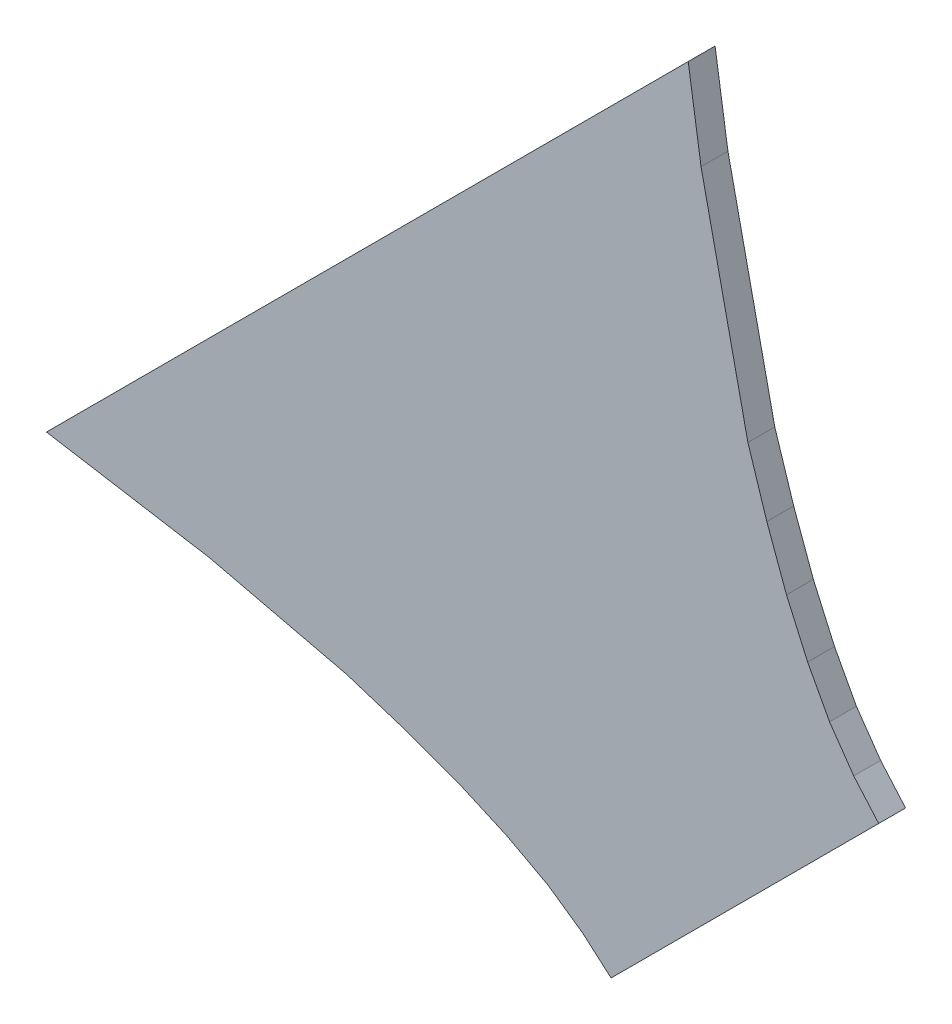
ISO-10303-21;
HEADER;
FILE_DESCRIPTION(('STEP AP214'),'2;1');
FILE_NAME('part.step','',(''),(''),'','','');
FILE_SCHEMA(('AUTOMOTIVE_DESIGN { 1 0 10303 214 1 1 1 1 }'));
ENDSEC;
DATA;
#1=APPLICATION_CONTEXT('core data for automotive mechanical design processes');
#2=APPLICATION_PROTOCOL_DEFINITION('international standard','automotive_design',2000,#1);
#3=PRODUCT_CONTEXT('',#1,'mechanical');
#4=PRODUCT('Part','Part','',(#3));
#5=PRODUCT_RELATED_PRODUCT_CATEGORY('part','',(#4));
#6=PRODUCT_DEFINITION_FORMATION('','',#4);
#7=PRODUCT_DEFINITION_CONTEXT('part definition',#1,'design');
#8=PRODUCT_DEFINITION('design','',#6,#7);
#9=PRODUCT_DEFINITION_SHAPE('','',#8);
#10=(LENGTH_UNIT() NAMED_UNIT(*) SI_UNIT(.MILLI.,.METRE.));
#11=(NAMED_UNIT(*) PLANE_ANGLE_UNIT() SI_UNIT($,.RADIAN.));
#12=(NAMED_UNIT(*) SI_UNIT($,.STERADIAN.) SOLID_ANGLE_UNIT());
#13=UNCERTAINTY_MEASURE_WITH_UNIT(LENGTH_MEASURE(1.E-05),#10,'distance_accuracy_value','');
#14=(GEOMETRIC_REPRESENTATION_CONTEXT(3) GLOBAL_UNCERTAINTY_ASSIGNED_CONTEXT((#13)) GLOBAL_UNIT_ASSIGNED_CONTEXT((#10,
#11,#12)) REPRESENTATION_CONTEXT('',''));
#15=CARTESIAN_POINT('',(0.,0.,0.));
#16=DIRECTION('',(0.,0.,1.));
#17=DIRECTION('',(1.,0.,0.));
#18=AXIS2_PLACEMENT_3D('',#15,#16,#17);
#19=CARTESIAN_POINT('',(51.6459999084473,106.226997375488,0.));
#20=DIRECTION('',(-0.755041017713103,-0.655677559148369,0.));
#21=DIRECTION('',(-0.655677559148369,0.755041017713103,0.));
#22=AXIS2_PLACEMENT_3D('',#19,#20,#21);
#23=PLANE('',#22);
#24=DIRECTION('',(-0.655677559148369,0.755041017713103,0.));
#25=VECTOR('',#24,1.);
#26=CARTESIAN_POINT('',(51.6459999084473,106.226997375488,0.03556));
#27=LINE('',#26,#25);
#28=CARTESIAN_POINT('',(51.6459999084473,106.226997375488,0.03556));
#29=VERTEX_POINT('',#28);
#30=CARTESIAN_POINT('',(51.6129989624023,106.264999389648,0.03556));
#31=VERTEX_POINT('',#30);
#32=EDGE_CURVE('E11',#29,#31,#27,.T.);
#33=ORIENTED_EDGE('',*,*,#32,.F.);
#34=DIRECTION('',(0.,0.,1.));
#35=VECTOR('',#34,1.);
#36=CARTESIAN_POINT('',(51.6459999084473,106.226997375488,0.));
#37=LINE('',#36,#35);
#38=CARTESIAN_POINT('',(51.6459999084473,106.226997375488,0.));
#39=VERTEX_POINT('',#38);
#40=EDGE_CURVE('E24',#39,#29,#37,.T.);
#41=ORIENTED_EDGE('',*,*,#40,.F.);
#42=DIRECTION('',(-0.655677559148369,0.755041017713103,0.));
#43=VECTOR('',#42,1.);
#44=CARTESIAN_POINT('',(51.6459999084473,106.226997375488,0.));
#45=LINE('',#44,#43);
#46=CARTESIAN_POINT('',(51.6129989624023,106.264999389648,0.));
#47=VERTEX_POINT('',#46);
#48=EDGE_CURVE('E160',#39,#47,#45,.T.);
#49=ORIENTED_EDGE('',*,*,#48,.T.);
#50=DIRECTION('',(0.,0.,1.));
#51=VECTOR('',#50,1.);
#52=CARTESIAN_POINT('',(51.6129989624023,106.264999389648,0.));
#53=LINE('',#52,#51);
#54=EDGE_CURVE('E37',#47,#31,#53,.T.);
#55=ORIENTED_EDGE('',*,*,#54,.T.);
#56=EDGE_LOOP('',(#33,#41,#49,#55));
#57=FACE_BOUND('',#56,.T.);
#58=ADVANCED_FACE('F17',(#57),#23,.F.);
#59=CARTESIAN_POINT('',(51.6129989624023,106.264999389648,0.));
#60=DIRECTION('',(-0.820910752232331,-0.571056509348548,0.));
#61=DIRECTION('',(-0.571056509348548,0.820910752232331,0.));
#62=AXIS2_PLACEMENT_3D('',#59,#60,#61);
#63=PLANE('',#62);
#64=DIRECTION('',(-0.571056509348548,0.820910752232331,0.));
#65=VECTOR('',#64,1.);
#66=CARTESIAN_POINT('',(51.6129989624023,106.264999389648,0.03556));
#67=LINE('',#66,#65);
#68=CARTESIAN_POINT('',(51.5810012817383,106.310997009277,0.03556));
#69=VERTEX_POINT('',#68);
#70=EDGE_CURVE('E280',#31,#69,#67,.T.);
#71=ORIENTED_EDGE('',*,*,#70,.F.);
#72=ORIENTED_EDGE('',*,*,#54,.F.);
#73=DIRECTION('',(-0.571056509348548,0.820910752232331,0.));
#74=VECTOR('',#73,1.);
#75=CARTESIAN_POINT('',(51.6129989624023,106.264999389648,0.));
#76=LINE('',#75,#74);
#77=CARTESIAN_POINT('',(51.5810012817383,106.310997009277,0.));
#78=VERTEX_POINT('',#77);
#79=EDGE_CURVE('E277',#47,#78,#76,.T.);
#80=ORIENTED_EDGE('',*,*,#79,.T.);
#81=DIRECTION('',(0.,0.,1.));
#82=VECTOR('',#81,1.);
#83=CARTESIAN_POINT('',(51.5810012817383,106.310997009277,0.));
#84=LINE('',#83,#82);
#85=EDGE_CURVE('E275',#78,#69,#84,.T.);
#86=ORIENTED_EDGE('',*,*,#85,.T.);
#87=EDGE_LOOP('',(#71,#72,#80,#86));
#88=FACE_BOUND('',#87,.T.);
#89=ADVANCED_FACE('F288',(#88),#63,.F.);
#90=CARTESIAN_POINT('',(51.5810012817383,106.310997009277,0.));
#91=DIRECTION('',(-0.88097617439256,-0.473160628278231,0.));
#92=DIRECTION('',(-0.473160628278231,0.88097617439256,0.));
#93=AXIS2_PLACEMENT_3D('',#90,#91,#92);
#94=PLANE('',#93);
#95=DIRECTION('',(-0.473160628278231,0.88097617439256,0.));
#96=VECTOR('',#95,1.);
#97=CARTESIAN_POINT('',(51.5810012817383,106.310997009277,0.03556));
#98=LINE('',#97,#96);
#99=CARTESIAN_POINT('',(51.5519981384277,106.36499786377,0.03556));
#100=VERTEX_POINT('',#99);
#101=EDGE_CURVE('E272',#69,#100,#98,.T.);
#102=ORIENTED_EDGE('',*,*,#101,.F.);
#103=ORIENTED_EDGE('',*,*,#85,.F.);
#104=DIRECTION('',(-0.473160628278231,0.88097617439256,0.));
#105=VECTOR('',#104,1.);
#106=CARTESIAN_POINT('',(51.5810012817383,106.310997009277,0.));
#107=LINE('',#106,#105);
#108=CARTESIAN_POINT('',(51.5519981384277,106.36499786377,0.));
#109=VERTEX_POINT('',#108);
#110=EDGE_CURVE('E269',#78,#109,#107,.T.);
#111=ORIENTED_EDGE('',*,*,#110,.T.);
#112=DIRECTION('',(0.,0.,1.));
#113=VECTOR('',#112,1.);
#114=CARTESIAN_POINT('',(51.5519981384277,106.36499786377,0.));
#115=LINE('',#114,#113);
#116=EDGE_CURVE('E267',#109,#100,#115,.T.);
#117=ORIENTED_EDGE('',*,*,#116,.T.);
#118=EDGE_LOOP('',(#102,#103,#111,#117));
#119=FACE_BOUND('',#118,.T.);
#120=ADVANCED_FACE('F294',(#119),#94,.F.);
#121=CARTESIAN_POINT('',(51.5519981384277,106.36499786377,0.));
#122=DIRECTION('',(-0.913820674891546,-0.406117931321382,0.));
#123=DIRECTION('',(-0.406117931321382,0.913820674891546,0.));
#124=AXIS2_PLACEMENT_3D('',#121,#122,#123);
#125=PLANE('',#124);
#126=DIRECTION('',(-0.406117931321382,0.913820674891546,0.));
#127=VECTOR('',#126,1.);
#128=CARTESIAN_POINT('',(51.5519981384277,106.36499786377,0.03556));
#129=LINE('',#128,#127);
#130=CARTESIAN_POINT('',(51.523998260498,106.428001403809,0.03556));
#131=VERTEX_POINT('',#130);
#132=EDGE_CURVE('E264',#100,#131,#129,.T.);
#133=ORIENTED_EDGE('',*,*,#132,.F.);
#134=ORIENTED_EDGE('',*,*,#116,.F.);
#135=DIRECTION('',(-0.406117931321382,0.913820674891546,0.));
#136=VECTOR('',#135,1.);
#137=CARTESIAN_POINT('',(51.5519981384277,106.36499786377,0.));
#138=LINE('',#137,#136);
#139=CARTESIAN_POINT('',(51.523998260498,106.428001403809,0.));
#140=VERTEX_POINT('',#139);
#141=EDGE_CURVE('E261',#109,#140,#138,.T.);
#142=ORIENTED_EDGE('',*,*,#141,.T.);
#143=DIRECTION('',(0.,0.,1.));
#144=VECTOR('',#143,1.);
#145=CARTESIAN_POINT('',(51.523998260498,106.428001403809,0.));
#146=LINE('',#145,#144);
#147=EDGE_CURVE('E259',#140,#131,#146,.T.);
#148=ORIENTED_EDGE('',*,*,#147,.T.);
#149=EDGE_LOOP('',(#133,#134,#142,#148));
#150=FACE_BOUND('',#149,.T.);
#151=ADVANCED_FACE('F296',(#150),#125,.F.);
#152=CARTESIAN_POINT('',(51.523998260498,106.428001403809,0.));
#153=DIRECTION('',(-0.939029508727631,-0.343836562539158,0.));
#154=DIRECTION('',(-0.343836562539158,0.939029508727631,0.));
#155=AXIS2_PLACEMENT_3D('',#152,#153,#154);
#156=PLANE('',#155);
#157=DIRECTION('',(-0.343836562539158,0.939029508727631,0.));
#158=VECTOR('',#157,1.);
#159=CARTESIAN_POINT('',(51.523998260498,106.428001403809,0.03556));
#160=LINE('',#159,#158);
#161=CARTESIAN_POINT('',(51.4980010986328,106.499000549316,0.03556));
#162=VERTEX_POINT('',#161);
#163=EDGE_CURVE('E256',#131,#162,#160,.T.);
#164=ORIENTED_EDGE('',*,*,#163,.F.);
#165=ORIENTED_EDGE('',*,*,#147,.F.);
#166=DIRECTION('',(-0.343836562539158,0.939029508727631,0.));
#167=VECTOR('',#166,1.);
#168=CARTESIAN_POINT('',(51.523998260498,106.428001403809,0.));
#169=LINE('',#168,#167);
#170=CARTESIAN_POINT('',(51.4980010986328,106.499000549316,0.));
#171=VERTEX_POINT('',#170);
#172=EDGE_CURVE('E253',#140,#171,#169,.T.);
#173=ORIENTED_EDGE('',*,*,#172,.T.);
#174=DIRECTION('',(0.,0.,1.));
#175=VECTOR('',#174,1.);
#176=CARTESIAN_POINT('',(51.4980010986328,106.499000549316,0.));
#177=LINE('',#176,#175);
#178=EDGE_CURVE('E251',#171,#162,#177,.T.);
#179=ORIENTED_EDGE('',*,*,#178,.T.);
#180=EDGE_LOOP('',(#164,#165,#173,#179));
#181=FACE_BOUND('',#180,.T.);
#182=ADVANCED_FACE('F301',(#181),#156,.F.);
#183=CARTESIAN_POINT('',(51.4980010986328,106.499000549316,0.));
#184=DIRECTION('',(-0.952280205556479,-0.305225179343562,0.));
#185=DIRECTION('',(-0.305225179343562,0.952280205556479,0.));
#186=AXIS2_PLACEMENT_3D('',#183,#184,#185);
#187=PLANE('',#186);
#188=DIRECTION('',(-0.305225179343562,0.952280205556479,0.));
#189=VECTOR('',#188,1.);
#190=CARTESIAN_POINT('',(51.4980010986328,106.499000549316,0.03556));
#191=LINE('',#190,#189);
#192=CARTESIAN_POINT('',(51.4729995727539,106.577003479004,0.03556));
#193=VERTEX_POINT('',#192);
#194=EDGE_CURVE('E248',#162,#193,#191,.T.);
#195=ORIENTED_EDGE('',*,*,#194,.F.);
#196=ORIENTED_EDGE('',*,*,#178,.F.);
#197=DIRECTION('',(-0.305225179343562,0.952280205556479,0.));
#198=VECTOR('',#197,1.);
#199=CARTESIAN_POINT('',(51.4980010986328,106.499000549316,0.));
#200=LINE('',#199,#198);
#201=CARTESIAN_POINT('',(51.4729995727539,106.577003479004,0.));
#202=VERTEX_POINT('',#201);
#203=EDGE_CURVE('E245',#171,#202,#200,.T.);
#204=ORIENTED_EDGE('',*,*,#203,.T.);
#205=DIRECTION('',(0.,0.,1.));
#206=VECTOR('',#205,1.);
#207=CARTESIAN_POINT('',(51.4729995727539,106.577003479004,0.));
#208=LINE('',#207,#206);
#209=EDGE_CURVE('E243',#202,#193,#208,.T.);
#210=ORIENTED_EDGE('',*,*,#209,.T.);
#211=EDGE_LOOP('',(#195,#196,#204,#210));
#212=FACE_BOUND('',#211,.T.);
#213=ADVANCED_FACE('F304',(#212),#187,.F.);
#214=CARTESIAN_POINT('',(51.4729995727539,106.577003479004,0.));
#215=DIRECTION('',(-0.977144599431555,-0.212575708399961,0.));
#216=DIRECTION('',(-0.212575708399961,0.977144599431555,0.));
#217=AXIS2_PLACEMENT_3D('',#214,#215,#216);
#218=PLANE('',#217);
#219=DIRECTION('',(-0.212575708399961,0.977144599431555,0.));
#220=VECTOR('',#219,1.);
#221=CARTESIAN_POINT('',(51.4729995727539,106.577003479004,0.03556));
#222=LINE('',#221,#220);
#223=CARTESIAN_POINT('',(51.4109992980957,106.861999511719,0.03556));
#224=VERTEX_POINT('',#223);
#225=EDGE_CURVE('E240',#193,#224,#222,.T.);
#226=ORIENTED_EDGE('',*,*,#225,.F.);
#227=ORIENTED_EDGE('',*,*,#209,.F.);
#228=DIRECTION('',(-0.212575708399961,0.977144599431555,0.));
#229=VECTOR('',#228,1.);
#230=CARTESIAN_POINT('',(51.4729995727539,106.577003479004,0.));
#231=LINE('',#230,#229);
#232=CARTESIAN_POINT('',(51.4109992980957,106.861999511719,0.));
#233=VERTEX_POINT('',#232);
#234=EDGE_CURVE('E237',#202,#233,#231,.T.);
#235=ORIENTED_EDGE('',*,*,#234,.T.);
#236=DIRECTION('',(0.,0.,1.));
#237=VECTOR('',#236,1.);
#238=CARTESIAN_POINT('',(51.4109992980957,106.861999511719,0.));
#239=LINE('',#238,#237);
#240=EDGE_CURVE('E235',#233,#224,#239,.T.);
#241=ORIENTED_EDGE('',*,*,#240,.T.);
#242=EDGE_LOOP('',(#226,#227,#235,#241));
#243=FACE_BOUND('',#242,.T.);
#244=ADVANCED_FACE('F309',(#243),#218,.F.);
#245=CARTESIAN_POINT('',(51.4109992980957,106.861999511719,0.));
#246=DIRECTION('',(-0.988677990191624,-0.150052763089028,0.));
#247=DIRECTION('',(-0.150052763089028,0.988677990191624,0.));
#248=AXIS2_PLACEMENT_3D('',#245,#246,#247);
#249=PLANE('',#248);
#250=DIRECTION('',(-0.150052763089028,0.988677990191624,0.));
#251=VECTOR('',#250,1.);
#252=CARTESIAN_POINT('',(51.4109992980957,106.861999511719,0.03556));
#253=LINE('',#252,#251);
#254=CARTESIAN_POINT('',(51.3940010070801,106.973999023438,0.03556));
#255=VERTEX_POINT('',#254);
#256=EDGE_CURVE('E232',#224,#255,#253,.T.);
#257=ORIENTED_EDGE('',*,*,#256,.F.);
#258=ORIENTED_EDGE('',*,*,#240,.F.);
#259=DIRECTION('',(-0.150052763089028,0.988677990191624,0.));
#260=VECTOR('',#259,1.);
#261=CARTESIAN_POINT('',(51.4109992980957,106.861999511719,0.));
#262=LINE('',#261,#260);
#263=CARTESIAN_POINT('',(51.3940010070801,106.973999023438,0.));
#264=VERTEX_POINT('',#263);
#265=EDGE_CURVE('E229',#233,#264,#262,.T.);
#266=ORIENTED_EDGE('',*,*,#265,.T.);
#267=DIRECTION('',(0.,0.,1.));
#268=VECTOR('',#267,1.);
#269=CARTESIAN_POINT('',(51.3940010070801,106.973999023438,0.));
#270=LINE('',#269,#268);
#271=EDGE_CURVE('E227',#264,#255,#270,.T.);
#272=ORIENTED_EDGE('',*,*,#271,.T.);
#273=EDGE_LOOP('',(#257,#258,#266,#272));
#274=FACE_BOUND('',#273,.T.);
#275=ADVANCED_FACE('F312',(#274),#249,.F.);
#276=CARTESIAN_POINT('',(51.3940010070801,106.973999023438,0.));
#277=DIRECTION('',(0.707105192612709,-0.707108369756817,0.));
#278=DIRECTION('',(-0.707108369756817,-0.707105192612709,0.));
#279=AXIS2_PLACEMENT_3D('',#276,#277,#278);
#280=PLANE('',#279);
#281=DIRECTION('',(-0.707108369756817,-0.707105192612709,0.));
#282=VECTOR('',#281,1.);
#283=CARTESIAN_POINT('',(51.3940010070801,106.973999023438,0.03556));
#284=LINE('',#283,#282);
#285=CARTESIAN_POINT('',(50.5449981689453,106.125,0.03556));
#286=VERTEX_POINT('',#285);
#287=EDGE_CURVE('E224',#255,#286,#284,.T.);
#288=ORIENTED_EDGE('',*,*,#287,.F.);
#289=ORIENTED_EDGE('',*,*,#271,.F.);
#290=DIRECTION('',(-0.707108369756817,-0.707105192612709,0.));
#291=VECTOR('',#290,1.);
#292=CARTESIAN_POINT('',(51.3940010070801,106.973999023438,0.));
#293=LINE('',#292,#291);
#294=CARTESIAN_POINT('',(50.5449981689453,106.125,0.));
#295=VERTEX_POINT('',#294);
#296=EDGE_CURVE('E221',#264,#295,#293,.T.);
#297=ORIENTED_EDGE('',*,*,#296,.T.);
#298=DIRECTION('',(0.,0.,1.));
#299=VECTOR('',#298,1.);
#300=CARTESIAN_POINT('',(50.5449981689453,106.125,0.));
#301=LINE('',#300,#299);
#302=EDGE_CURVE('E219',#295,#286,#301,.T.);
#303=ORIENTED_EDGE('',*,*,#302,.T.);
#304=EDGE_LOOP('',(#288,#289,#297,#303));
#305=FACE_BOUND('',#304,.T.);
#306=ADVANCED_FACE('F317',(#305),#280,.F.);
#307=CARTESIAN_POINT('',(50.5449981689453,106.125,0.));
#308=DIRECTION('',(0.165156602988561,0.986267355481909,0.));
#309=DIRECTION('',(0.986267355481909,-0.165156602988561,0.));
#310=AXIS2_PLACEMENT_3D('',#307,#308,#309);
#311=PLANE('',#310);
#312=DIRECTION('',(0.986267355481909,-0.16515660298856,0.));
#313=VECTOR('',#312,1.);
#314=CARTESIAN_POINT('',(50.5449981689453,106.125,0.03556));
#315=LINE('',#314,#313);
#316=CARTESIAN_POINT('',(50.7599983215332,106.088996887207,0.03556));
#317=VERTEX_POINT('',#316);
#318=EDGE_CURVE('E216',#286,#317,#315,.T.);
#319=ORIENTED_EDGE('',*,*,#318,.F.);
#320=ORIENTED_EDGE('',*,*,#302,.F.);
#321=DIRECTION('',(0.986267355481909,-0.16515660298856,0.));
#322=VECTOR('',#321,1.);
#323=CARTESIAN_POINT('',(50.5449981689453,106.125,0.));
#324=LINE('',#323,#322);
#325=CARTESIAN_POINT('',(50.7599983215332,106.088996887207,0.));
#326=VERTEX_POINT('',#325);
#327=EDGE_CURVE('E213',#295,#326,#324,.T.);
#328=ORIENTED_EDGE('',*,*,#327,.T.);
#329=DIRECTION('',(0.,0.,1.));
#330=VECTOR('',#329,1.);
#331=CARTESIAN_POINT('',(50.7599983215332,106.088996887207,0.));
#332=LINE('',#331,#330);
#333=EDGE_CURVE('E211',#326,#317,#332,.T.);
#334=ORIENTED_EDGE('',*,*,#333,.T.);
#335=EDGE_LOOP('',(#319,#320,#328,#334));
#336=FACE_BOUND('',#335,.T.);
#337=ADVANCED_FACE('F320',(#336),#311,.F.);
#338=CARTESIAN_POINT('',(50.7599983215332,106.088996887207,0.));
#339=DIRECTION('',(0.229926049289909,0.973208103058094,0.));
#340=DIRECTION('',(0.973208103058094,-0.229926049289909,0.));
#341=AXIS2_PLACEMENT_3D('',#338,#339,#340);
#342=PLANE('',#341);
#343=DIRECTION('',(0.973208103058094,-0.229926049289909,0.));
#344=VECTOR('',#343,1.);
#345=CARTESIAN_POINT('',(50.7599983215332,106.088996887207,0.03556));
#346=LINE('',#345,#344);
#347=CARTESIAN_POINT('',(50.9420013427734,106.045997619629,0.03556));
#348=VERTEX_POINT('',#347);
#349=EDGE_CURVE('E208',#317,#348,#346,.T.);
#350=ORIENTED_EDGE('',*,*,#349,.F.);
#351=ORIENTED_EDGE('',*,*,#333,.F.);
#352=DIRECTION('',(0.973208103058094,-0.229926049289909,0.));
#353=VECTOR('',#352,1.);
#354=CARTESIAN_POINT('',(50.7599983215332,106.088996887207,0.));
#355=LINE('',#354,#353);
#356=CARTESIAN_POINT('',(50.9420013427734,106.045997619629,0.));
#357=VERTEX_POINT('',#356);
#358=EDGE_CURVE('E205',#326,#357,#355,.T.);
#359=ORIENTED_EDGE('',*,*,#358,.T.);
#360=DIRECTION('',(0.,0.,1.));
#361=VECTOR('',#360,1.);
#362=CARTESIAN_POINT('',(50.9420013427734,106.045997619629,0.));
#363=LINE('',#362,#361);
#364=EDGE_CURVE('E203',#357,#348,#363,.T.);
#365=ORIENTED_EDGE('',*,*,#364,.T.);
#366=EDGE_LOOP('',(#350,#351,#359,#365));
#367=FACE_BOUND('',#366,.T.);
#368=ADVANCED_FACE('F325',(#367),#342,.F.);
#369=CARTESIAN_POINT('',(50.9420013427734,106.045997619629,0.));
#370=DIRECTION('',(0.305154245258206,0.952302938460706,0.));
#371=DIRECTION('',(0.952302938460706,-0.305154245258206,0.));
#372=AXIS2_PLACEMENT_3D('',#369,#370,#371);
#373=PLANE('',#372);
#374=DIRECTION('',(0.952302938460706,-0.305154245258206,0.));
#375=VECTOR('',#374,1.);
#376=CARTESIAN_POINT('',(50.9420013427734,106.045997619629,0.03556));
#377=LINE('',#376,#375);
#378=CARTESIAN_POINT('',(51.0200004577637,106.021003723145,0.03556));
#379=VERTEX_POINT('',#378);
#380=EDGE_CURVE('E200',#348,#379,#377,.T.);
#381=ORIENTED_EDGE('',*,*,#380,.F.);
#382=ORIENTED_EDGE('',*,*,#364,.F.);
#383=DIRECTION('',(0.952302938460706,-0.305154245258206,0.));
#384=VECTOR('',#383,1.);
#385=CARTESIAN_POINT('',(50.9420013427734,106.045997619629,0.));
#386=LINE('',#385,#384);
#387=CARTESIAN_POINT('',(51.0200004577637,106.021003723145,0.));
#388=VERTEX_POINT('',#387);
#389=EDGE_CURVE('E197',#357,#388,#386,.T.);
#390=ORIENTED_EDGE('',*,*,#389,.T.);
#391=DIRECTION('',(0.,0.,1.));
#392=VECTOR('',#391,1.);
#393=CARTESIAN_POINT('',(51.0200004577637,106.021003723145,0.));
#394=LINE('',#393,#392);
#395=EDGE_CURVE('E195',#388,#379,#394,.T.);
#396=ORIENTED_EDGE('',*,*,#395,.T.);
#397=EDGE_LOOP('',(#381,#382,#390,#396));
#398=FACE_BOUND('',#397,.T.);
#399=ADVANCED_FACE('F328',(#398),#373,.F.);
#400=CARTESIAN_POINT('',(51.0200004577637,106.021003723145,0.));
#401=DIRECTION('',(0.343881049565291,0.939013218091138,0.));
#402=DIRECTION('',(0.939013218091138,-0.343881049565291,0.));
#403=AXIS2_PLACEMENT_3D('',#400,#401,#402);
#404=PLANE('',#403);
#405=DIRECTION('',(0.939013218091137,-0.343881049565291,0.));
#406=VECTOR('',#405,1.);
#407=CARTESIAN_POINT('',(51.0200004577637,106.021003723145,0.03556));
#408=LINE('',#407,#406);
#409=CARTESIAN_POINT('',(51.0909996032715,105.995002746582,0.03556));
#410=VERTEX_POINT('',#409);
#411=EDGE_CURVE('E192',#379,#410,#408,.T.);
#412=ORIENTED_EDGE('',*,*,#411,.F.);
#413=ORIENTED_EDGE('',*,*,#395,.F.);
#414=DIRECTION('',(0.939013218091137,-0.343881049565291,0.));
#415=VECTOR('',#414,1.);
#416=CARTESIAN_POINT('',(51.0200004577637,106.021003723145,0.));
#417=LINE('',#416,#415);
#418=CARTESIAN_POINT('',(51.0909996032715,105.995002746582,0.));
#419=VERTEX_POINT('',#418);
#420=EDGE_CURVE('E189',#388,#419,#417,.T.);
#421=ORIENTED_EDGE('',*,*,#420,.T.);
#422=DIRECTION('',(0.,0.,1.));
#423=VECTOR('',#422,1.);
#424=CARTESIAN_POINT('',(51.0909996032715,105.995002746582,0.));
#425=LINE('',#424,#423);
#426=EDGE_CURVE('E187',#419,#410,#425,.T.);
#427=ORIENTED_EDGE('',*,*,#426,.T.);
#428=EDGE_LOOP('',(#412,#413,#421,#427));
#429=FACE_BOUND('',#428,.T.);
#430=ADVANCED_FACE('F333',(#429),#404,.F.);
#431=CARTESIAN_POINT('',(51.0909996032715,105.995002746582,0.));
#432=DIRECTION('',(0.406138466053448,0.913811548620257,0.));
#433=DIRECTION('',(0.913811548620257,-0.406138466053448,0.));
#434=AXIS2_PLACEMENT_3D('',#431,#432,#433);
#435=PLANE('',#434);
#436=DIRECTION('',(0.913811548620257,-0.406138466053448,0.));
#437=VECTOR('',#436,1.);
#438=CARTESIAN_POINT('',(51.0909996032715,105.995002746582,0.03556));
#439=LINE('',#438,#437);
#440=CARTESIAN_POINT('',(51.1539993286133,105.967002868652,0.03556));
#441=VERTEX_POINT('',#440);
#442=EDGE_CURVE('E184',#410,#441,#439,.T.);
#443=ORIENTED_EDGE('',*,*,#442,.F.);
#444=ORIENTED_EDGE('',*,*,#426,.F.);
#445=DIRECTION('',(0.913811548620257,-0.406138466053448,0.));
#446=VECTOR('',#445,1.);
#447=CARTESIAN_POINT('',(51.0909996032715,105.995002746582,0.));
#448=LINE('',#447,#446);
#449=CARTESIAN_POINT('',(51.1539993286133,105.967002868652,0.));
#450=VERTEX_POINT('',#449);
#451=EDGE_CURVE('E181',#419,#450,#448,.T.);
#452=ORIENTED_EDGE('',*,*,#451,.T.);
#453=DIRECTION('',(0.,0.,1.));
#454=VECTOR('',#453,1.);
#455=CARTESIAN_POINT('',(51.1539993286133,105.967002868652,0.));
#456=LINE('',#455,#454);
#457=EDGE_CURVE('E179',#450,#441,#456,.T.);
#458=ORIENTED_EDGE('',*,*,#457,.T.);
#459=EDGE_LOOP('',(#443,#444,#452,#458));
#460=FACE_BOUND('',#459,.T.);
#461=ADVANCED_FACE('F336',(#460),#435,.F.);
#462=CARTESIAN_POINT('',(51.1539993286133,105.967002868652,0.));
#463=DIRECTION('',(0.473112325610403,0.881002115409217,0.));
#464=DIRECTION('',(0.881002115409217,-0.473112325610403,0.));
#465=AXIS2_PLACEMENT_3D('',#462,#463,#464);
#466=PLANE('',#465);
#467=DIRECTION('',(0.881002115409217,-0.473112325610403,0.));
#468=VECTOR('',#467,1.);
#469=CARTESIAN_POINT('',(51.1539993286133,105.967002868652,0.03556));
#470=LINE('',#469,#468);
#471=CARTESIAN_POINT('',(51.2080001831055,105.938003540039,0.03556));
#472=VERTEX_POINT('',#471);
#473=EDGE_CURVE('E176',#441,#472,#470,.T.);
#474=ORIENTED_EDGE('',*,*,#473,.F.);
#475=ORIENTED_EDGE('',*,*,#457,.F.);
#476=DIRECTION('',(0.881002115409217,-0.473112325610403,0.));
#477=VECTOR('',#476,1.);
#478=CARTESIAN_POINT('',(51.1539993286133,105.967002868652,0.));
#479=LINE('',#478,#477);
#480=CARTESIAN_POINT('',(51.2080001831055,105.938003540039,0.));
#481=VERTEX_POINT('',#480);
#482=EDGE_CURVE('E173',#450,#481,#479,.T.);
#483=ORIENTED_EDGE('',*,*,#482,.T.);
#484=DIRECTION('',(0.,0.,1.));
#485=VECTOR('',#484,1.);
#486=CARTESIAN_POINT('',(51.2080001831055,105.938003540039,0.));
#487=LINE('',#486,#485);
#488=EDGE_CURVE('E171',#481,#472,#487,.T.);
#489=ORIENTED_EDGE('',*,*,#488,.T.);
#490=EDGE_LOOP('',(#474,#475,#483,#489));
#491=FACE_BOUND('',#490,.T.);
#492=ADVANCED_FACE('F341',(#491),#466,.F.);
#493=CARTESIAN_POINT('',(51.2080001831055,105.938003540039,0.));
#494=DIRECTION('',(0.571116342479002,0.82086912681219,0.));
#495=DIRECTION('',(0.82086912681219,-0.571116342479002,0.));
#496=AXIS2_PLACEMENT_3D('',#493,#494,#495);
#497=PLANE('',#496);
#498=DIRECTION('',(0.82086912681219,-0.571116342479002,0.));
#499=VECTOR('',#498,1.);
#500=CARTESIAN_POINT('',(51.2080001831055,105.938003540039,0.03556));
#501=LINE('',#500,#499);
#502=CARTESIAN_POINT('',(51.2540016174316,105.905998229981,0.03556));
#503=VERTEX_POINT('',#502);
#504=EDGE_CURVE('E168',#472,#503,#501,.T.);
#505=ORIENTED_EDGE('',*,*,#504,.F.);
#506=ORIENTED_EDGE('',*,*,#488,.F.);
#507=DIRECTION('',(0.82086912681219,-0.571116342479002,0.));
#508=VECTOR('',#507,1.);
#509=CARTESIAN_POINT('',(51.2080001831055,105.938003540039,0.));
#510=LINE('',#509,#508);
#511=CARTESIAN_POINT('',(51.2540016174316,105.905998229981,0.));
#512=VERTEX_POINT('',#511);
#513=EDGE_CURVE('E166',#481,#512,#510,.T.);
#514=ORIENTED_EDGE('',*,*,#513,.T.);
#515=DIRECTION('',(0.,0.,1.));
#516=VECTOR('',#515,1.);
#517=CARTESIAN_POINT('',(51.2540016174316,105.905998229981,0.));
#518=LINE('',#517,#516);
#519=EDGE_CURVE('E151',#512,#503,#518,.T.);
#520=ORIENTED_EDGE('',*,*,#519,.T.);
#521=EDGE_LOOP('',(#505,#506,#514,#520));
#522=FACE_BOUND('',#521,.T.);
#523=ADVANCED_FACE('F343',(#522),#497,.F.);
#524=CARTESIAN_POINT('',(51.2540016174316,105.905998229981,0.));
#525=DIRECTION('',(0.655671872333227,0.755045956105349,0.));
#526=DIRECTION('',(0.755045956105349,-0.655671872333227,0.));
#527=AXIS2_PLACEMENT_3D('',#524,#525,#526);
#528=PLANE('',#527);
#529=DIRECTION('',(0.755045956105349,-0.655671872333227,0.));
#530=VECTOR('',#529,1.);
#531=CARTESIAN_POINT('',(51.2540016174316,105.905998229981,0.03556));
#532=LINE('',#531,#530);
#533=CARTESIAN_POINT('',(51.2919998168945,105.873001098633,0.03556));
#534=VERTEX_POINT('',#533);
#535=EDGE_CURVE('E155',#503,#534,#532,.T.);
#536=ORIENTED_EDGE('',*,*,#535,.F.);
#537=ORIENTED_EDGE('',*,*,#519,.F.);
#538=DIRECTION('',(0.755045956105349,-0.655671872333227,0.));
#539=VECTOR('',#538,1.);
#540=CARTESIAN_POINT('',(51.2540016174316,105.905998229981,0.));
#541=LINE('',#540,#539);
#542=CARTESIAN_POINT('',(51.2919998168945,105.873001098633,0.));
#543=VERTEX_POINT('',#542);
#544=EDGE_CURVE('E147',#512,#543,#541,.T.);
#545=ORIENTED_EDGE('',*,*,#544,.T.);
#546=DIRECTION('',(0.,0.,1.));
#547=VECTOR('',#546,1.);
#548=CARTESIAN_POINT('',(51.2919998168945,105.873001098633,0.));
#549=LINE('',#548,#547);
#550=EDGE_CURVE('E137',#543,#534,#549,.T.);
#551=ORIENTED_EDGE('',*,*,#550,.T.);
#552=EDGE_LOOP('',(#536,#537,#545,#551));
#553=FACE_BOUND('',#552,.T.);
#554=ADVANCED_FACE('F150',(#553),#528,.F.);
#555=CARTESIAN_POINT('',(51.2919998168945,105.873001098633,0.));
#556=DIRECTION('',(-0.70710297127213,0.707110591080437,0.));
#557=DIRECTION('',(0.707110591080437,0.70710297127213,0.));
#558=AXIS2_PLACEMENT_3D('',#555,#556,#557);
#559=PLANE('',#558);
#560=DIRECTION('',(0.707110591080437,0.70710297127213,0.));
#561=VECTOR('',#560,1.);
#562=CARTESIAN_POINT('',(51.2919998168945,105.873001098633,0.03556));
#563=LINE('',#562,#561);
#564=EDGE_CURVE('E143',#534,#29,#563,.T.);
#565=ORIENTED_EDGE('',*,*,#564,.F.);
#566=ORIENTED_EDGE('',*,*,#550,.F.);
#567=DIRECTION('',(0.707110591080437,0.70710297127213,0.));
#568=VECTOR('',#567,1.);
#569=CARTESIAN_POINT('',(51.2919998168945,105.873001098633,0.));
#570=LINE('',#569,#568);
#571=EDGE_CURVE('E141',#543,#39,#570,.T.);
#572=ORIENTED_EDGE('',*,*,#571,.T.);
#573=ORIENTED_EDGE('',*,*,#40,.T.);
#574=EDGE_LOOP('',(#565,#566,#572,#573));
#575=FACE_BOUND('',#574,.T.);
#576=ADVANCED_FACE('F139',(#575),#559,.F.);
#577=CARTESIAN_POINT('',(51.6459999084473,106.226997375488,0.));
#578=DIRECTION('',(0.,0.,1.));
#579=DIRECTION('',(1.,0.,0.));
#580=AXIS2_PLACEMENT_3D('',#577,#578,#579);
#581=PLANE('',#580);
#582=ORIENTED_EDGE('',*,*,#571,.F.);
#583=ORIENTED_EDGE('',*,*,#544,.F.);
#584=ORIENTED_EDGE('',*,*,#513,.F.);
#585=ORIENTED_EDGE('',*,*,#482,.F.);
#586=ORIENTED_EDGE('',*,*,#451,.F.);
#587=ORIENTED_EDGE('',*,*,#420,.F.);
#588=ORIENTED_EDGE('',*,*,#389,.F.);
#589=ORIENTED_EDGE('',*,*,#358,.F.);
#590=ORIENTED_EDGE('',*,*,#327,.F.);
#591=ORIENTED_EDGE('',*,*,#296,.F.);
#592=ORIENTED_EDGE('',*,*,#265,.F.);
#593=ORIENTED_EDGE('',*,*,#234,.F.);
#594=ORIENTED_EDGE('',*,*,#203,.F.);
#595=ORIENTED_EDGE('',*,*,#172,.F.);
#596=ORIENTED_EDGE('',*,*,#141,.F.);
#597=ORIENTED_EDGE('',*,*,#110,.F.);
#598=ORIENTED_EDGE('',*,*,#79,.F.);
#599=ORIENTED_EDGE('',*,*,#48,.F.);
#600=EDGE_LOOP('',(#582,#583,#584,#585,#586,#587,#588,#589,#590,#591,#592,#593,#594,#595,#596,
#597,#598,#599));
#601=FACE_BOUND('',#600,.T.);
#602=ADVANCED_FACE('F158',(#601),#581,.F.);
#603=CARTESIAN_POINT('',(51.6459999084473,106.226997375488,0.03556));
#604=DIRECTION('',(0.,0.,1.));
#605=DIRECTION('',(1.,0.,0.));
#606=AXIS2_PLACEMENT_3D('',#603,#604,#605);
#607=PLANE('',#606);
#608=ORIENTED_EDGE('',*,*,#32,.T.);
#609=ORIENTED_EDGE('',*,*,#70,.T.);
#610=ORIENTED_EDGE('',*,*,#101,.T.);
#611=ORIENTED_EDGE('',*,*,#132,.T.);
#612=ORIENTED_EDGE('',*,*,#163,.T.);
#613=ORIENTED_EDGE('',*,*,#194,.T.);
#614=ORIENTED_EDGE('',*,*,#225,.T.);
#615=ORIENTED_EDGE('',*,*,#256,.T.);
#616=ORIENTED_EDGE('',*,*,#287,.T.);
#617=ORIENTED_EDGE('',*,*,#318,.T.);
#618=ORIENTED_EDGE('',*,*,#349,.T.);
#619=ORIENTED_EDGE('',*,*,#380,.T.);
#620=ORIENTED_EDGE('',*,*,#411,.T.);
#621=ORIENTED_EDGE('',*,*,#442,.T.);
#622=ORIENTED_EDGE('',*,*,#473,.T.);
#623=ORIENTED_EDGE('',*,*,#504,.T.);
#624=ORIENTED_EDGE('',*,*,#535,.T.);
#625=ORIENTED_EDGE('',*,*,#564,.T.);
#626=EDGE_LOOP('',(#608,#609,#610,#611,#612,#613,#614,#615,#616,#617,#618,#619,#620,#621,#622,
#623,#624,#625));
#627=FACE_BOUND('',#626,.T.);
#628=ADVANCED_FACE('F291',(#627),#607,.T.);
#629=CLOSED_SHELL('',(#58,#89,#120,#151,#182,#213,#244,#275,#306,#337,#368,#399,#430,#461,#492,
#523,#554,#576,#602,#628));
#630=MANIFOLD_SOLID_BREP('B1',#629);
#631=ADVANCED_BREP_SHAPE_REPRESENTATION('',(#18,#630),#14);
#632=SHAPE_DEFINITION_REPRESENTATION(#9,#631);
ENDSEC;
END-ISO-10303-21;
